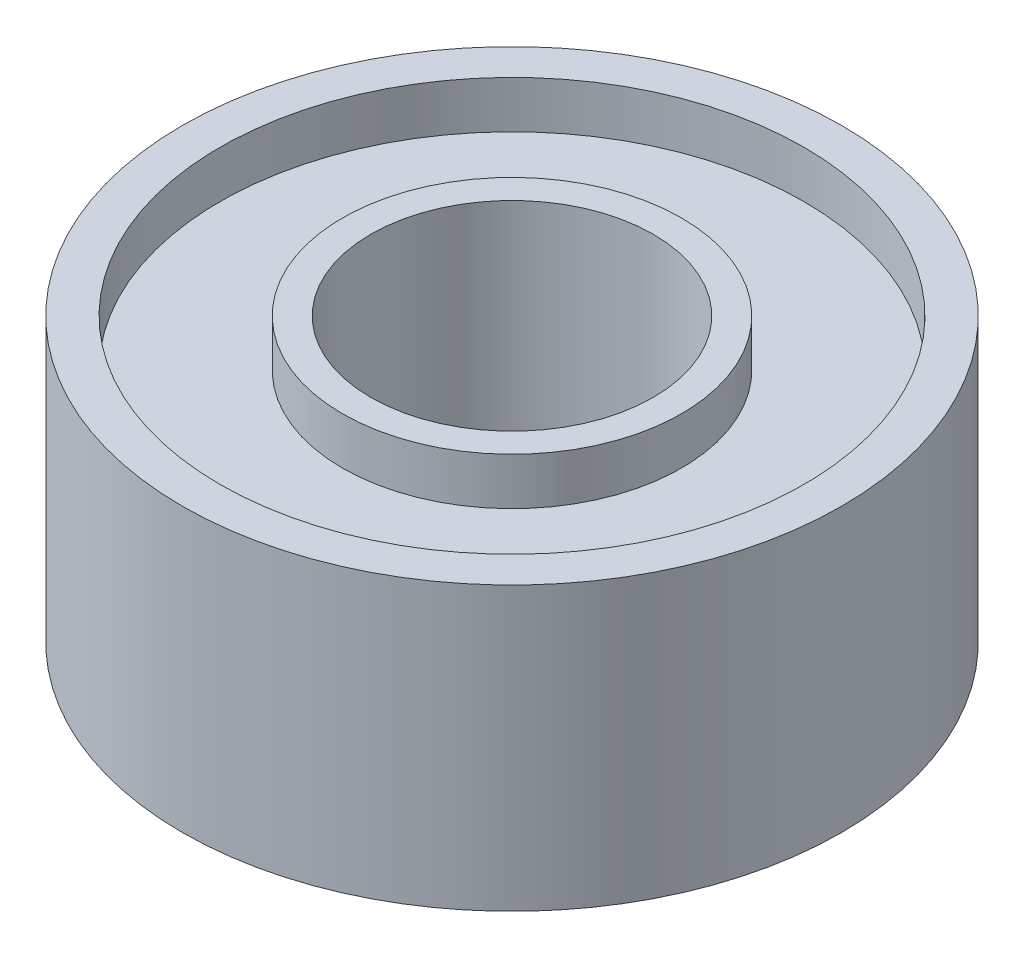
ISO-10303-21;
HEADER;
FILE_DESCRIPTION(('STEP AP214'),'2;1');
FILE_NAME('part.step','',(''),(''),'','','');
FILE_SCHEMA(('AUTOMOTIVE_DESIGN { 1 0 10303 214 1 1 1 1 }'));
ENDSEC;
DATA;
#1=APPLICATION_CONTEXT('core data for automotive mechanical design processes');
#2=APPLICATION_PROTOCOL_DEFINITION('international standard','automotive_design',2000,#1);
#3=PRODUCT_CONTEXT('',#1,'mechanical');
#4=PRODUCT('Part','Part','',(#3));
#5=PRODUCT_RELATED_PRODUCT_CATEGORY('part','',(#4));
#6=PRODUCT_DEFINITION_FORMATION('','',#4);
#7=PRODUCT_DEFINITION_CONTEXT('part definition',#1,'design');
#8=PRODUCT_DEFINITION('design','',#6,#7);
#9=PRODUCT_DEFINITION_SHAPE('','',#8);
#10=(LENGTH_UNIT() NAMED_UNIT(*) SI_UNIT(.MILLI.,.METRE.));
#11=(NAMED_UNIT(*) PLANE_ANGLE_UNIT() SI_UNIT($,.RADIAN.));
#12=(NAMED_UNIT(*) SI_UNIT($,.STERADIAN.) SOLID_ANGLE_UNIT());
#13=UNCERTAINTY_MEASURE_WITH_UNIT(LENGTH_MEASURE(1.E-05),#10,'distance_accuracy_value','');
#14=(GEOMETRIC_REPRESENTATION_CONTEXT(3) GLOBAL_UNCERTAINTY_ASSIGNED_CONTEXT((#13)) GLOBAL_UNIT_ASSIGNED_CONTEXT((#10,
#11,#12)) REPRESENTATION_CONTEXT('',''));
#15=CARTESIAN_POINT('',(0.,0.,0.));
#16=DIRECTION('',(0.,0.,1.));
#17=DIRECTION('',(1.,0.,0.));
#18=AXIS2_PLACEMENT_3D('',#15,#16,#17);
#19=CARTESIAN_POINT('',(0.,0.,0.));
#20=DIRECTION('',(0.,1.,0.));
#21=DIRECTION('',(0.,0.,1.));
#22=AXIS2_PLACEMENT_3D('',#19,#20,#21);
#23=PLANE('',#22);
#24=CARTESIAN_POINT('',(0.,0.,0.));
#25=DIRECTION('',(0.,1.,0.));
#26=DIRECTION('',(0.,0.,1.));
#27=AXIS2_PLACEMENT_3D('',#24,#25,#26);
#28=CIRCLE('',#27,1.5);
#29=CARTESIAN_POINT('',(0.,0.,1.5));
#30=VERTEX_POINT('',#29);
#31=EDGE_CURVE('E45',#30,#30,#28,.T.);
#32=ORIENTED_EDGE('',*,*,#31,.T.);
#33=EDGE_LOOP('',(#32));
#34=FACE_BOUND('',#33,.T.);
#35=CARTESIAN_POINT('',(0.,0.,0.));
#36=DIRECTION('',(0.,1.,0.));
#37=DIRECTION('',(0.,0.,1.));
#38=AXIS2_PLACEMENT_3D('',#35,#36,#37);
#39=CIRCLE('',#38,1.8);
#40=CARTESIAN_POINT('',(0.,0.,1.8));
#41=VERTEX_POINT('',#40);
#42=EDGE_CURVE('E69',#41,#41,#39,.T.);
#43=ORIENTED_EDGE('',*,*,#42,.F.);
#44=EDGE_LOOP('',(#43));
#45=FACE_BOUND('',#44,.T.);
#46=ADVANCED_FACE('F32',(#34,#45),#23,.F.);
#47=CARTESIAN_POINT('',(0.,3.,0.));
#48=DIRECTION('',(0.,1.,0.));
#49=DIRECTION('',(0.,0.,1.));
#50=AXIS2_PLACEMENT_3D('',#47,#48,#49);
#51=PLANE('',#50);
#52=CARTESIAN_POINT('',(0.,3.,0.));
#53=DIRECTION('',(0.,1.,0.));
#54=DIRECTION('',(0.,0.,1.));
#55=AXIS2_PLACEMENT_3D('',#52,#53,#54);
#56=CIRCLE('',#55,1.5);
#57=CARTESIAN_POINT('',(0.,3.,1.5));
#58=VERTEX_POINT('',#57);
#59=EDGE_CURVE('E43',#58,#58,#56,.T.);
#60=ORIENTED_EDGE('',*,*,#59,.F.);
#61=EDGE_LOOP('',(#60));
#62=FACE_BOUND('',#61,.T.);
#63=CARTESIAN_POINT('',(0.,3.,0.));
#64=DIRECTION('',(0.,1.,0.));
#65=DIRECTION('',(0.,0.,1.));
#66=AXIS2_PLACEMENT_3D('',#63,#64,#65);
#67=CIRCLE('',#66,1.8);
#68=CARTESIAN_POINT('',(0.,3.,1.8));
#69=VERTEX_POINT('',#68);
#70=EDGE_CURVE('E57',#69,#69,#67,.T.);
#71=ORIENTED_EDGE('',*,*,#70,.T.);
#72=EDGE_LOOP('',(#71));
#73=FACE_BOUND('',#72,.T.);
#74=ADVANCED_FACE('F85',(#62,#73),#51,.T.);
#75=CARTESIAN_POINT('',(0.,3.,0.));
#76=DIRECTION('',(0.,1.,0.));
#77=DIRECTION('',(0.,0.,1.));
#78=AXIS2_PLACEMENT_3D('',#75,#76,#77);
#79=CIRCLE('',#78,3.1);
#80=CARTESIAN_POINT('',(0.,3.,3.1));
#81=VERTEX_POINT('',#80);
#82=EDGE_CURVE('E51',#81,#81,#79,.T.);
#83=ORIENTED_EDGE('',*,*,#82,.F.);
#84=EDGE_LOOP('',(#83));
#85=FACE_BOUND('',#84,.T.);
#86=CARTESIAN_POINT('',(0.,3.,0.));
#87=DIRECTION('',(0.,1.,0.));
#88=DIRECTION('',(0.,0.,1.));
#89=AXIS2_PLACEMENT_3D('',#86,#87,#88);
#90=CIRCLE('',#89,3.5);
#91=CARTESIAN_POINT('',(0.,3.,3.5));
#92=VERTEX_POINT('',#91);
#93=EDGE_CURVE('E10',#92,#92,#90,.T.);
#94=ORIENTED_EDGE('',*,*,#93,.T.);
#95=EDGE_LOOP('',(#94));
#96=FACE_BOUND('',#95,.T.);
#97=ADVANCED_FACE('F91',(#85,#96),#51,.T.);
#98=CARTESIAN_POINT('',(0.,0.,0.));
#99=DIRECTION('',(0.,1.,0.));
#100=DIRECTION('',(0.,0.,1.));
#101=AXIS2_PLACEMENT_3D('',#98,#99,#100);
#102=CIRCLE('',#101,3.1);
#103=CARTESIAN_POINT('',(0.,0.,3.1));
#104=VERTEX_POINT('',#103);
#105=EDGE_CURVE('E63',#104,#104,#102,.T.);
#106=ORIENTED_EDGE('',*,*,#105,.T.);
#107=EDGE_LOOP('',(#106));
#108=FACE_BOUND('',#107,.T.);
#109=CARTESIAN_POINT('',(0.,0.,0.));
#110=DIRECTION('',(0.,1.,0.));
#111=DIRECTION('',(0.,0.,1.));
#112=AXIS2_PLACEMENT_3D('',#109,#110,#111);
#113=CIRCLE('',#112,3.5);
#114=CARTESIAN_POINT('',(0.,0.,3.5));
#115=VERTEX_POINT('',#114);
#116=EDGE_CURVE('E36',#115,#115,#113,.T.);
#117=ORIENTED_EDGE('',*,*,#116,.F.);
#118=EDGE_LOOP('',(#117));
#119=FACE_BOUND('',#118,.T.);
#120=ADVANCED_FACE('F87',(#108,#119),#23,.F.);
#121=CARTESIAN_POINT('',(0.,3.,0.));
#122=DIRECTION('',(0.,-1.,0.));
#123=DIRECTION('',(0.,0.,-1.));
#124=AXIS2_PLACEMENT_3D('',#121,#122,#123);
#125=CYLINDRICAL_SURFACE('',#124,3.5);
#126=ORIENTED_EDGE('',*,*,#93,.F.);
#127=EDGE_LOOP('',(#126));
#128=FACE_BOUND('',#127,.T.);
#129=ORIENTED_EDGE('',*,*,#116,.T.);
#130=EDGE_LOOP('',(#129));
#131=FACE_BOUND('',#130,.T.);
#132=ADVANCED_FACE('F34',(#128,#131),#125,.T.);
#133=CARTESIAN_POINT('',(0.,3.,0.));
#134=DIRECTION('',(0.,-1.,0.));
#135=DIRECTION('',(0.,0.,-1.));
#136=AXIS2_PLACEMENT_3D('',#133,#134,#135);
#137=CYLINDRICAL_SURFACE('',#136,1.5);
#138=ORIENTED_EDGE('',*,*,#59,.T.);
#139=EDGE_LOOP('',(#138));
#140=FACE_BOUND('',#139,.T.);
#141=ORIENTED_EDGE('',*,*,#31,.F.);
#142=EDGE_LOOP('',(#141));
#143=FACE_BOUND('',#142,.T.);
#144=ADVANCED_FACE('F100',(#140,#143),#137,.F.);
#145=CARTESIAN_POINT('',(0.,2.5,0.));
#146=DIRECTION('',(0.,1.,0.));
#147=DIRECTION('',(0.,0.,1.));
#148=AXIS2_PLACEMENT_3D('',#145,#146,#147);
#149=CYLINDRICAL_SURFACE('',#148,3.1);
#150=CARTESIAN_POINT('',(0.,2.5,0.));
#151=DIRECTION('',(0.,1.,0.));
#152=DIRECTION('',(0.,0.,1.));
#153=AXIS2_PLACEMENT_3D('',#150,#151,#152);
#154=CIRCLE('',#153,3.1);
#155=CARTESIAN_POINT('',(0.,2.5,3.1));
#156=VERTEX_POINT('',#155);
#157=EDGE_CURVE('E48',#156,#156,#154,.T.);
#158=ORIENTED_EDGE('',*,*,#157,.F.);
#159=EDGE_LOOP('',(#158));
#160=FACE_BOUND('',#159,.T.);
#161=ORIENTED_EDGE('',*,*,#82,.T.);
#162=EDGE_LOOP('',(#161));
#163=FACE_BOUND('',#162,.T.);
#164=ADVANCED_FACE('F124',(#160,#163),#149,.F.);
#165=CARTESIAN_POINT('',(0.,2.5,0.));
#166=DIRECTION('',(0.,1.,0.));
#167=DIRECTION('',(0.,0.,1.));
#168=AXIS2_PLACEMENT_3D('',#165,#166,#167);
#169=PLANE('',#168);
#170=CARTESIAN_POINT('',(0.,2.5,0.));
#171=DIRECTION('',(0.,1.,0.));
#172=DIRECTION('',(0.,0.,1.));
#173=AXIS2_PLACEMENT_3D('',#170,#171,#172);
#174=CIRCLE('',#173,1.8);
#175=CARTESIAN_POINT('',(0.,2.5,1.8));
#176=VERTEX_POINT('',#175);
#177=EDGE_CURVE('E54',#176,#176,#174,.T.);
#178=ORIENTED_EDGE('',*,*,#177,.F.);
#179=EDGE_LOOP('',(#178));
#180=FACE_BOUND('',#179,.T.);
#181=ORIENTED_EDGE('',*,*,#157,.T.);
#182=EDGE_LOOP('',(#181));
#183=FACE_BOUND('',#182,.T.);
#184=ADVANCED_FACE('F120',(#180,#183),#169,.T.);
#185=CARTESIAN_POINT('',(0.,2.5,0.));
#186=DIRECTION('',(0.,1.,0.));
#187=DIRECTION('',(0.,0.,1.));
#188=AXIS2_PLACEMENT_3D('',#185,#186,#187);
#189=CYLINDRICAL_SURFACE('',#188,1.8);
#190=ORIENTED_EDGE('',*,*,#177,.T.);
#191=EDGE_LOOP('',(#190));
#192=FACE_BOUND('',#191,.T.);
#193=ORIENTED_EDGE('',*,*,#70,.F.);
#194=EDGE_LOOP('',(#193));
#195=FACE_BOUND('',#194,.T.);
#196=ADVANCED_FACE('F114',(#192,#195),#189,.T.);
#197=CARTESIAN_POINT('',(0.,0.5,0.));
#198=DIRECTION('',(0.,-1.,0.));
#199=DIRECTION('',(0.,0.,1.));
#200=AXIS2_PLACEMENT_3D('',#197,#198,#199);
#201=PLANE('',#200);
#202=CARTESIAN_POINT('',(0.,0.5,0.));
#203=DIRECTION('',(0.,1.,0.));
#204=DIRECTION('',(0.,0.,1.));
#205=AXIS2_PLACEMENT_3D('',#202,#203,#204);
#206=CIRCLE('',#205,3.1);
#207=CARTESIAN_POINT('',(0.,0.5,3.1));
#208=VERTEX_POINT('',#207);
#209=EDGE_CURVE('E60',#208,#208,#206,.T.);
#210=ORIENTED_EDGE('',*,*,#209,.F.);
#211=EDGE_LOOP('',(#210));
#212=FACE_BOUND('',#211,.T.);
#213=CARTESIAN_POINT('',(0.,0.5,0.));
#214=DIRECTION('',(0.,1.,0.));
#215=DIRECTION('',(0.,0.,1.));
#216=AXIS2_PLACEMENT_3D('',#213,#214,#215);
#217=CIRCLE('',#216,1.8);
#218=CARTESIAN_POINT('',(0.,0.5,1.8));
#219=VERTEX_POINT('',#218);
#220=EDGE_CURVE('E66',#219,#219,#217,.T.);
#221=ORIENTED_EDGE('',*,*,#220,.T.);
#222=EDGE_LOOP('',(#221));
#223=FACE_BOUND('',#222,.T.);
#224=ADVANCED_FACE('F75',(#212,#223),#201,.T.);
#225=CARTESIAN_POINT('',(0.,0.5,0.));
#226=DIRECTION('',(0.,-1.,0.));
#227=DIRECTION('',(0.,0.,-1.));
#228=AXIS2_PLACEMENT_3D('',#225,#226,#227);
#229=CYLINDRICAL_SURFACE('',#228,3.1);
#230=ORIENTED_EDGE('',*,*,#209,.T.);
#231=EDGE_LOOP('',(#230));
#232=FACE_BOUND('',#231,.T.);
#233=ORIENTED_EDGE('',*,*,#105,.F.);
#234=EDGE_LOOP('',(#233));
#235=FACE_BOUND('',#234,.T.);
#236=ADVANCED_FACE('F80',(#232,#235),#229,.F.);
#237=CARTESIAN_POINT('',(0.,0.5,0.));
#238=DIRECTION('',(0.,-1.,0.));
#239=DIRECTION('',(0.,0.,-1.));
#240=AXIS2_PLACEMENT_3D('',#237,#238,#239);
#241=CYLINDRICAL_SURFACE('',#240,1.8);
#242=ORIENTED_EDGE('',*,*,#220,.F.);
#243=EDGE_LOOP('',(#242));
#244=FACE_BOUND('',#243,.T.);
#245=ORIENTED_EDGE('',*,*,#42,.T.);
#246=EDGE_LOOP('',(#245));
#247=FACE_BOUND('',#246,.T.);
#248=ADVANCED_FACE('F77',(#244,#247),#241,.T.);
#249=CLOSED_SHELL('',(#46,#74,#97,#120,#132,#144,#164,#184,#196,#224,#236,#248));
#250=MANIFOLD_SOLID_BREP('B2',#249);
#251=ADVANCED_BREP_SHAPE_REPRESENTATION('',(#18,#250),#14);
#252=SHAPE_DEFINITION_REPRESENTATION(#9,#251);
ENDSEC;
END-ISO-10303-21;
